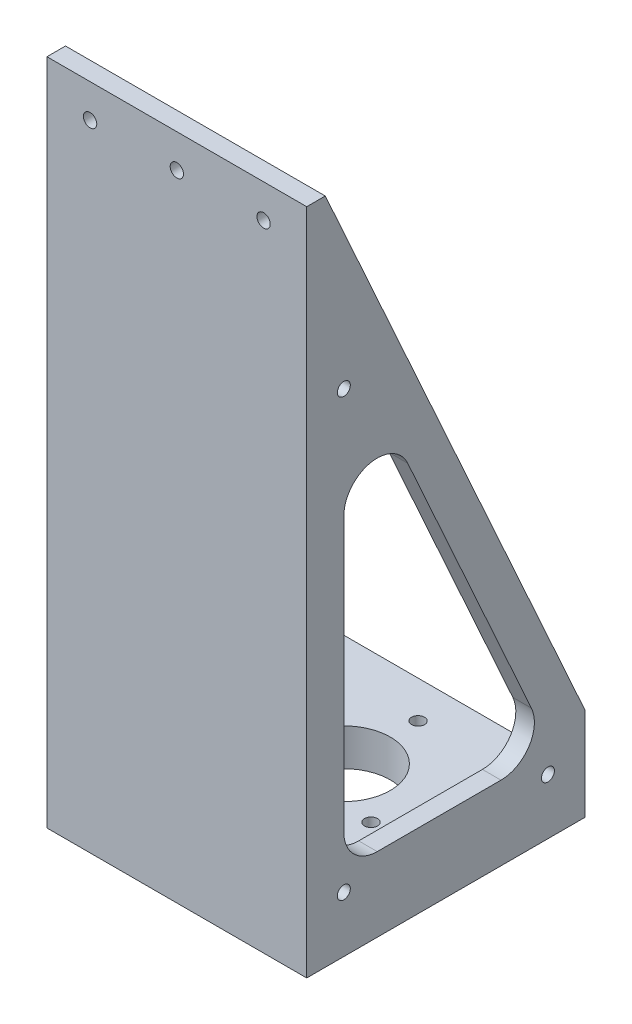
ISO-10303-21;
HEADER;
FILE_DESCRIPTION(('STEP AP214'),'2;1');
FILE_NAME('part.step','',(''),(''),'','','');
FILE_SCHEMA(('AUTOMOTIVE_DESIGN { 1 0 10303 214 1 1 1 1 }'));
ENDSEC;
DATA;
#1=APPLICATION_CONTEXT('core data for automotive mechanical design processes');
#2=APPLICATION_PROTOCOL_DEFINITION('international standard','automotive_design',2000,#1);
#3=PRODUCT_CONTEXT('',#1,'mechanical');
#4=PRODUCT('Part','Part','',(#3));
#5=PRODUCT_RELATED_PRODUCT_CATEGORY('part','',(#4));
#6=PRODUCT_DEFINITION_FORMATION('','',#4);
#7=PRODUCT_DEFINITION_CONTEXT('part definition',#1,'design');
#8=PRODUCT_DEFINITION('design','',#6,#7);
#9=PRODUCT_DEFINITION_SHAPE('','',#8);
#10=(LENGTH_UNIT() NAMED_UNIT(*) SI_UNIT(.MILLI.,.METRE.));
#11=(NAMED_UNIT(*) PLANE_ANGLE_UNIT() SI_UNIT($,.RADIAN.));
#12=(NAMED_UNIT(*) SI_UNIT($,.STERADIAN.) SOLID_ANGLE_UNIT());
#13=UNCERTAINTY_MEASURE_WITH_UNIT(LENGTH_MEASURE(1.E-05),#10,'distance_accuracy_value','');
#14=(GEOMETRIC_REPRESENTATION_CONTEXT(3) GLOBAL_UNCERTAINTY_ASSIGNED_CONTEXT((#13)) GLOBAL_UNIT_ASSIGNED_CONTEXT((#10,
#11,#12)) REPRESENTATION_CONTEXT('',''));
#15=CARTESIAN_POINT('',(0.,0.,0.));
#16=DIRECTION('',(0.,0.,1.));
#17=DIRECTION('',(1.,0.,0.));
#18=AXIS2_PLACEMENT_3D('',#15,#16,#17);
#19=CARTESIAN_POINT('',(0.,10.,0.));
#20=DIRECTION('',(0.,-1.,0.));
#21=DIRECTION('',(0.,0.,-1.));
#22=AXIS2_PLACEMENT_3D('',#19,#20,#21);
#23=PLANE('',#22);
#24=CARTESIAN_POINT('',(0.,10.,0.));
#25=DIRECTION('',(0.,1.,0.));
#26=DIRECTION('',(0.,0.,1.));
#27=AXIS2_PLACEMENT_3D('',#24,#25,#26);
#28=CIRCLE('',#27,12.5);
#29=CARTESIAN_POINT('',(0.,10.,12.5));
#30=VERTEX_POINT('',#29);
#31=EDGE_CURVE('E431',#30,#30,#28,.T.);
#32=ORIENTED_EDGE('',*,*,#31,.F.);
#33=EDGE_LOOP('',(#32));
#34=FACE_BOUND('',#33,.T.);
#35=CARTESIAN_POINT('',(0.,10.,-20.));
#36=DIRECTION('',(0.,1.,0.));
#37=DIRECTION('',(0.,0.,1.));
#38=AXIS2_PLACEMENT_3D('',#35,#36,#37);
#39=CIRCLE('',#38,1.75);
#40=CARTESIAN_POINT('',(0.,10.,-18.25));
#41=VERTEX_POINT('',#40);
#42=EDGE_CURVE('E421',#41,#41,#39,.T.);
#43=ORIENTED_EDGE('',*,*,#42,.F.);
#44=EDGE_LOOP('',(#43));
#45=FACE_BOUND('',#44,.T.);
#46=CARTESIAN_POINT('',(17.3205080756901,10.,9.99999999999926));
#47=DIRECTION('',(0.,1.,0.));
#48=DIRECTION('',(0.,0.,1.));
#49=AXIS2_PLACEMENT_3D('',#46,#47,#48);
#50=CIRCLE('',#49,1.75000000000109);
#51=CARTESIAN_POINT('',(17.3205080756901,10.,11.7500000000004));
#52=VERTEX_POINT('',#51);
#53=EDGE_CURVE('E413',#52,#52,#50,.T.);
#54=ORIENTED_EDGE('',*,*,#53,.F.);
#55=EDGE_LOOP('',(#54));
#56=FACE_BOUND('',#55,.T.);
#57=CARTESIAN_POINT('',(-17.3205080756875,10.,10.0000000000007));
#58=DIRECTION('',(0.,1.,0.));
#59=DIRECTION('',(0.,0.,1.));
#60=AXIS2_PLACEMENT_3D('',#57,#58,#59);
#61=CIRCLE('',#60,1.7500000000016);
#62=CARTESIAN_POINT('',(-17.3205080756875,10.,11.7500000000023));
#63=VERTEX_POINT('',#62);
#64=EDGE_CURVE('E410',#63,#63,#61,.T.);
#65=ORIENTED_EDGE('',*,*,#64,.F.);
#66=EDGE_LOOP('',(#65));
#67=FACE_BOUND('',#66,.T.);
#68=DIRECTION('',(0.,0.,-1.));
#69=VECTOR('',#68,1.);
#70=CARTESIAN_POINT('',(-30.,10.,0.));
#71=LINE('',#70,#69);
#72=CARTESIAN_POINT('',(-30.,10.,40.));
#73=VERTEX_POINT('',#72);
#74=CARTESIAN_POINT('',(-30.,10.,-30.));
#75=VERTEX_POINT('',#74);
#76=EDGE_CURVE('E468',#73,#75,#71,.T.);
#77=ORIENTED_EDGE('',*,*,#76,.F.);
#78=DIRECTION('',(1.,0.,0.));
#79=VECTOR('',#78,1.);
#80=CARTESIAN_POINT('',(0.,10.,40.));
#81=LINE('',#80,#79);
#82=CARTESIAN_POINT('',(30.,9.99999999999999,40.));
#83=VERTEX_POINT('',#82);
#84=EDGE_CURVE('E343',#73,#83,#81,.T.);
#85=ORIENTED_EDGE('',*,*,#84,.T.);
#86=DIRECTION('',(0.,0.,1.));
#87=VECTOR('',#86,1.);
#88=CARTESIAN_POINT('',(30.,10.,0.));
#89=LINE('',#88,#87);
#90=CARTESIAN_POINT('',(30.,10.,-30.));
#91=VERTEX_POINT('',#90);
#92=EDGE_CURVE('E375',#91,#83,#89,.T.);
#93=ORIENTED_EDGE('',*,*,#92,.F.);
#94=DIRECTION('',(-1.,0.,0.));
#95=VECTOR('',#94,1.);
#96=CARTESIAN_POINT('',(-35.,10.,-30.));
#97=LINE('',#96,#95);
#98=EDGE_CURVE('E437',#91,#75,#97,.T.);
#99=ORIENTED_EDGE('',*,*,#98,.T.);
#100=EDGE_LOOP('',(#77,#85,#93,#99));
#101=FACE_BOUND('',#100,.T.);
#102=ADVANCED_FACE('F44',(#34,#45,#56,#67,#101),#23,.F.);
#103=CARTESIAN_POINT('',(0.,0.,0.));
#104=DIRECTION('',(0.,-1.,0.));
#105=DIRECTION('',(0.,0.,-1.));
#106=AXIS2_PLACEMENT_3D('',#103,#104,#105);
#107=PLANE('',#106);
#108=DIRECTION('',(-1.,0.,0.));
#109=VECTOR('',#108,1.);
#110=CARTESIAN_POINT('',(-35.,0.,-30.));
#111=LINE('',#110,#109);
#112=CARTESIAN_POINT('',(35.,0.,-30.));
#113=VERTEX_POINT('',#112);
#114=CARTESIAN_POINT('',(-35.,0.,-30.));
#115=VERTEX_POINT('',#114);
#116=EDGE_CURVE('E443',#113,#115,#111,.T.);
#117=ORIENTED_EDGE('',*,*,#116,.F.);
#118=DIRECTION('',(0.,0.,-1.));
#119=VECTOR('',#118,1.);
#120=CARTESIAN_POINT('',(35.,0.,45.));
#121=LINE('',#120,#119);
#122=CARTESIAN_POINT('',(35.,0.,45.));
#123=VERTEX_POINT('',#122);
#124=EDGE_CURVE('E448',#123,#113,#121,.T.);
#125=ORIENTED_EDGE('',*,*,#124,.F.);
#126=DIRECTION('',(1.,0.,0.));
#127=VECTOR('',#126,1.);
#128=CARTESIAN_POINT('',(-35.,0.,45.));
#129=LINE('',#128,#127);
#130=CARTESIAN_POINT('',(-35.,0.,45.));
#131=VERTEX_POINT('',#130);
#132=EDGE_CURVE('E450',#131,#123,#129,.T.);
#133=ORIENTED_EDGE('',*,*,#132,.F.);
#134=DIRECTION('',(0.,0.,1.));
#135=VECTOR('',#134,1.);
#136=CARTESIAN_POINT('',(-35.,0.,45.));
#137=LINE('',#136,#135);
#138=EDGE_CURVE('E434',#115,#131,#137,.T.);
#139=ORIENTED_EDGE('',*,*,#138,.F.);
#140=EDGE_LOOP('',(#117,#125,#133,#139));
#141=FACE_BOUND('',#140,.T.);
#142=CARTESIAN_POINT('',(17.3205080756901,0.,9.99999999999926));
#143=DIRECTION('',(0.,1.,0.));
#144=DIRECTION('',(0.,0.,1.));
#145=AXIS2_PLACEMENT_3D('',#142,#143,#144);
#146=CIRCLE('',#145,1.75000000000109);
#147=CARTESIAN_POINT('',(17.3205080756901,0.,11.7500000000004));
#148=VERTEX_POINT('',#147);
#149=EDGE_CURVE('E412',#148,#148,#146,.T.);
#150=ORIENTED_EDGE('',*,*,#149,.T.);
#151=EDGE_LOOP('',(#150));
#152=FACE_BOUND('',#151,.T.);
#153=CARTESIAN_POINT('',(0.,0.,0.));
#154=DIRECTION('',(0.,1.,0.));
#155=DIRECTION('',(0.,0.,1.));
#156=AXIS2_PLACEMENT_3D('',#153,#154,#155);
#157=CIRCLE('',#156,12.5);
#158=CARTESIAN_POINT('',(0.,0.,12.5));
#159=VERTEX_POINT('',#158);
#160=EDGE_CURVE('E430',#159,#159,#157,.T.);
#161=ORIENTED_EDGE('',*,*,#160,.T.);
#162=EDGE_LOOP('',(#161));
#163=FACE_BOUND('',#162,.T.);
#164=CARTESIAN_POINT('',(0.,0.,-20.));
#165=DIRECTION('',(0.,1.,0.));
#166=DIRECTION('',(0.,0.,1.));
#167=AXIS2_PLACEMENT_3D('',#164,#165,#166);
#168=CIRCLE('',#167,1.75);
#169=CARTESIAN_POINT('',(0.,0.,-18.25));
#170=VERTEX_POINT('',#169);
#171=EDGE_CURVE('E419',#170,#170,#168,.T.);
#172=ORIENTED_EDGE('',*,*,#171,.T.);
#173=EDGE_LOOP('',(#172));
#174=FACE_BOUND('',#173,.T.);
#175=CARTESIAN_POINT('',(-17.3205080756875,0.,10.0000000000007));
#176=DIRECTION('',(0.,1.,0.));
#177=DIRECTION('',(0.,0.,1.));
#178=AXIS2_PLACEMENT_3D('',#175,#176,#177);
#179=CIRCLE('',#178,1.7500000000016);
#180=CARTESIAN_POINT('',(-17.3205080756875,0.,11.7500000000023));
#181=VERTEX_POINT('',#180);
#182=EDGE_CURVE('E396',#181,#181,#179,.T.);
#183=ORIENTED_EDGE('',*,*,#182,.T.);
#184=EDGE_LOOP('',(#183));
#185=FACE_BOUND('',#184,.T.);
#186=ADVANCED_FACE('F527',(#141,#152,#163,#174,#185),#107,.T.);
#187=CARTESIAN_POINT('',(-35.,10.,45.));
#188=DIRECTION('',(1.,0.,0.));
#189=DIRECTION('',(0.,0.,-1.));
#190=AXIS2_PLACEMENT_3D('',#187,#188,#189);
#191=PLANE('',#190);
#192=CARTESIAN_POINT('',(-35.,15.,-20.));
#193=DIRECTION('',(-1.,0.,0.));
#194=DIRECTION('',(0.,0.,1.));
#195=AXIS2_PLACEMENT_3D('',#192,#193,#194);
#196=CIRCLE('',#195,1.75);
#197=CARTESIAN_POINT('',(-35.,15.,-18.25));
#198=VERTEX_POINT('',#197);
#199=EDGE_CURVE('E897',#198,#198,#196,.T.);
#200=ORIENTED_EDGE('',*,*,#199,.F.);
#201=EDGE_LOOP('',(#200));
#202=FACE_BOUND('',#201,.T.);
#203=CARTESIAN_POINT('',(-35.,15.,35.));
#204=DIRECTION('',(-1.,0.,0.));
#205=DIRECTION('',(0.,0.,1.));
#206=AXIS2_PLACEMENT_3D('',#203,#204,#205);
#207=CIRCLE('',#206,1.75);
#208=CARTESIAN_POINT('',(-35.,15.,36.75));
#209=VERTEX_POINT('',#208);
#210=EDGE_CURVE('E926',#209,#209,#207,.T.);
#211=ORIENTED_EDGE('',*,*,#210,.F.);
#212=EDGE_LOOP('',(#211));
#213=FACE_BOUND('',#212,.T.);
#214=CARTESIAN_POINT('',(-35.,132.484247103511,35.));
#215=DIRECTION('',(-1.,0.,0.));
#216=DIRECTION('',(0.,0.,1.));
#217=AXIS2_PLACEMENT_3D('',#214,#215,#216);
#218=CIRCLE('',#217,1.75);
#219=CARTESIAN_POINT('',(-35.,132.484247103511,36.75));
#220=VERTEX_POINT('',#219);
#221=EDGE_CURVE('E243',#220,#220,#218,.T.);
#222=ORIENTED_EDGE('',*,*,#221,.F.);
#223=EDGE_LOOP('',(#222));
#224=FACE_BOUND('',#223,.T.);
#225=DIRECTION('',(0.,1.,0.));
#226=VECTOR('',#225,1.);
#227=CARTESIAN_POINT('',(-35.,102.837189188257,35.));
#228=LINE('',#227,#226);
#229=CARTESIAN_POINT('',(-35.,29.,35.));
#230=VERTEX_POINT('',#229);
#231=CARTESIAN_POINT('',(-35.,102.837189188257,35.));
#232=VERTEX_POINT('',#231);
#233=EDGE_CURVE('E245',#230,#232,#228,.T.);
#234=ORIENTED_EDGE('',*,*,#233,.F.);
#235=CARTESIAN_POINT('',(-35.,29.,26.));
#236=DIRECTION('',(-1.,0.,0.));
#237=DIRECTION('',(0.,0.,1.));
#238=AXIS2_PLACEMENT_3D('',#235,#236,#237);
#239=CIRCLE('',#238,8.99999999999999);
#240=CARTESIAN_POINT('',(-35.,20.,26.));
#241=VERTEX_POINT('',#240);
#242=EDGE_CURVE('E64',#241,#230,#239,.T.);
#243=ORIENTED_EDGE('',*,*,#242,.F.);
#244=DIRECTION('',(0.,0.,1.));
#245=VECTOR('',#244,1.);
#246=CARTESIAN_POINT('',(-35.,20.,26.));
#247=LINE('',#246,#245);
#248=CARTESIAN_POINT('',(-35.,20.,-7.34582737534168));
#249=VERTEX_POINT('',#248);
#250=EDGE_CURVE('E216',#249,#241,#247,.T.);
#251=ORIENTED_EDGE('',*,*,#250,.F.);
#252=CARTESIAN_POINT('',(-35.,29.,-7.34582737534168));
#253=DIRECTION('',(-1.,0.,0.));
#254=DIRECTION('',(0.,0.,1.));
#255=AXIS2_PLACEMENT_3D('',#252,#253,#254);
#256=CIRCLE('',#255,9.);
#257=CARTESIAN_POINT('',(-35.,32.7042805018385,-15.5481627722697));
#258=VERTEX_POINT('',#257);
#259=EDGE_CURVE('E223',#258,#249,#256,.T.);
#260=ORIENTED_EDGE('',*,*,#259,.F.);
#261=DIRECTION('',(0.,-0.911370599658675,-0.411586722426498));
#262=VECTOR('',#261,1.);
#263=CARTESIAN_POINT('',(-35.,32.7042805018385,-15.5481627722697));
#264=LINE('',#263,#262);
#265=CARTESIAN_POINT('',(-35.,106.541469690095,17.7976646030719));
#266=VERTEX_POINT('',#265);
#267=EDGE_CURVE('E252',#266,#258,#264,.T.);
#268=ORIENTED_EDGE('',*,*,#267,.F.);
#269=CARTESIAN_POINT('',(-35.,102.837189188257,26.));
#270=DIRECTION('',(-1.,0.,0.));
#271=DIRECTION('',(0.,0.,1.));
#272=AXIS2_PLACEMENT_3D('',#269,#270,#271);
#273=CIRCLE('',#272,8.99999999999999);
#274=EDGE_CURVE('E250',#232,#266,#273,.T.);
#275=ORIENTED_EDGE('',*,*,#274,.F.);
#276=EDGE_LOOP('',(#234,#243,#251,#260,#268,#275));
#277=FACE_BOUND('',#276,.T.);
#278=DIRECTION('',(0.,0.,-1.));
#279=VECTOR('',#278,1.);
#280=CARTESIAN_POINT('',(-35.,180.,45.));
#281=LINE('',#280,#279);
#282=CARTESIAN_POINT('',(-35.,180.,45.));
#283=VERTEX_POINT('',#282);
#284=CARTESIAN_POINT('',(-35.,180.,40.));
#285=VERTEX_POINT('',#284);
#286=EDGE_CURVE('E378',#283,#285,#281,.T.);
#287=ORIENTED_EDGE('',*,*,#286,.T.);
#288=DIRECTION('',(0.,-0.911370599658675,-0.411586722426498));
#289=VECTOR('',#288,1.);
#290=CARTESIAN_POINT('',(-35.,180.,40.));
#291=LINE('',#290,#289);
#292=CARTESIAN_POINT('',(-35.,25.,-30.));
#293=VERTEX_POINT('',#292);
#294=EDGE_CURVE('E383',#285,#293,#291,.T.);
#295=ORIENTED_EDGE('',*,*,#294,.T.);
#296=DIRECTION('',(0.,-1.,0.));
#297=VECTOR('',#296,1.);
#298=CARTESIAN_POINT('',(-35.,10.,-30.));
#299=LINE('',#298,#297);
#300=EDGE_CURVE('E442',#293,#115,#299,.T.);
#301=ORIENTED_EDGE('',*,*,#300,.T.);
#302=ORIENTED_EDGE('',*,*,#138,.T.);
#303=DIRECTION('',(0.,-1.,0.));
#304=VECTOR('',#303,1.);
#305=CARTESIAN_POINT('',(-35.,10.,45.));
#306=LINE('',#305,#304);
#307=EDGE_CURVE('E467',#283,#131,#306,.T.);
#308=ORIENTED_EDGE('',*,*,#307,.F.);
#309=EDGE_LOOP('',(#287,#295,#301,#302,#308));
#310=FACE_BOUND('',#309,.T.);
#311=ADVANCED_FACE('F50',(#202,#213,#224,#277,#310),#191,.F.);
#312=CARTESIAN_POINT('',(-35.,10.,45.));
#313=DIRECTION('',(0.,0.,-1.));
#314=DIRECTION('',(-1.,0.,0.));
#315=AXIS2_PLACEMENT_3D('',#312,#313,#314);
#316=PLANE('',#315);
#317=CARTESIAN_POINT('',(23.375,171.,45.));
#318=DIRECTION('',(0.,0.,-1.));
#319=DIRECTION('',(-1.,0.,0.));
#320=AXIS2_PLACEMENT_3D('',#317,#318,#319);
#321=CIRCLE('',#320,1.8);
#322=CARTESIAN_POINT('',(21.575,171.,45.));
#323=VERTEX_POINT('',#322);
#324=EDGE_CURVE('E319',#323,#323,#321,.T.);
#325=ORIENTED_EDGE('',*,*,#324,.T.);
#326=EDGE_LOOP('',(#325));
#327=FACE_BOUND('',#326,.T.);
#328=CARTESIAN_POINT('',(-23.375,171.,45.));
#329=DIRECTION('',(0.,0.,-1.));
#330=DIRECTION('',(-1.,0.,0.));
#331=AXIS2_PLACEMENT_3D('',#328,#329,#330);
#332=CIRCLE('',#331,1.8);
#333=CARTESIAN_POINT('',(-25.175,171.,45.));
#334=VERTEX_POINT('',#333);
#335=EDGE_CURVE('E332',#334,#334,#332,.T.);
#336=ORIENTED_EDGE('',*,*,#335,.T.);
#337=EDGE_LOOP('',(#336));
#338=FACE_BOUND('',#337,.T.);
#339=CARTESIAN_POINT('',(0.,171.,45.));
#340=DIRECTION('',(0.,0.,-1.));
#341=DIRECTION('',(-1.,0.,0.));
#342=AXIS2_PLACEMENT_3D('',#339,#340,#341);
#343=CIRCLE('',#342,1.8);
#344=CARTESIAN_POINT('',(-1.8,171.,45.));
#345=VERTEX_POINT('',#344);
#346=EDGE_CURVE('E320',#345,#345,#343,.T.);
#347=ORIENTED_EDGE('',*,*,#346,.T.);
#348=EDGE_LOOP('',(#347));
#349=FACE_BOUND('',#348,.T.);
#350=DIRECTION('',(0.,-1.,0.));
#351=VECTOR('',#350,1.);
#352=CARTESIAN_POINT('',(35.,10.,45.));
#353=LINE('',#352,#351);
#354=CARTESIAN_POINT('',(35.,180.,45.));
#355=VERTEX_POINT('',#354);
#356=EDGE_CURVE('E465',#355,#123,#353,.T.);
#357=ORIENTED_EDGE('',*,*,#356,.F.);
#358=DIRECTION('',(-1.,0.,0.));
#359=VECTOR('',#358,1.);
#360=CARTESIAN_POINT('',(-30.,180.,45.));
#361=LINE('',#360,#359);
#362=EDGE_CURVE('E386',#355,#283,#361,.T.);
#363=ORIENTED_EDGE('',*,*,#362,.T.);
#364=ORIENTED_EDGE('',*,*,#307,.T.);
#365=ORIENTED_EDGE('',*,*,#132,.T.);
#366=EDGE_LOOP('',(#357,#363,#364,#365));
#367=FACE_BOUND('',#366,.T.);
#368=ADVANCED_FACE('F543',(#327,#338,#349,#367),#316,.F.);
#369=CARTESIAN_POINT('',(35.,10.,45.));
#370=DIRECTION('',(-1.,0.,0.));
#371=DIRECTION('',(0.,0.,1.));
#372=AXIS2_PLACEMENT_3D('',#369,#370,#371);
#373=PLANE('',#372);
#374=CARTESIAN_POINT('',(35.,15.,-20.));
#375=DIRECTION('',(-1.,0.,0.));
#376=DIRECTION('',(0.,0.,1.));
#377=AXIS2_PLACEMENT_3D('',#374,#375,#376);
#378=CIRCLE('',#377,1.75);
#379=CARTESIAN_POINT('',(35.,15.,-18.25));
#380=VERTEX_POINT('',#379);
#381=EDGE_CURVE('E228',#380,#380,#378,.T.);
#382=ORIENTED_EDGE('',*,*,#381,.T.);
#383=EDGE_LOOP('',(#382));
#384=FACE_BOUND('',#383,.T.);
#385=CARTESIAN_POINT('',(35.,15.,35.));
#386=DIRECTION('',(-1.,0.,0.));
#387=DIRECTION('',(0.,0.,1.));
#388=AXIS2_PLACEMENT_3D('',#385,#386,#387);
#389=CIRCLE('',#388,1.75);
#390=CARTESIAN_POINT('',(35.,15.,36.75));
#391=VERTEX_POINT('',#390);
#392=EDGE_CURVE('E923',#391,#391,#389,.T.);
#393=ORIENTED_EDGE('',*,*,#392,.T.);
#394=EDGE_LOOP('',(#393));
#395=FACE_BOUND('',#394,.T.);
#396=CARTESIAN_POINT('',(35.,132.484247103511,35.));
#397=DIRECTION('',(-1.,0.,0.));
#398=DIRECTION('',(0.,0.,1.));
#399=AXIS2_PLACEMENT_3D('',#396,#397,#398);
#400=CIRCLE('',#399,1.75);
#401=CARTESIAN_POINT('',(35.,132.484247103511,36.75));
#402=VERTEX_POINT('',#401);
#403=EDGE_CURVE('E937',#402,#402,#400,.T.);
#404=ORIENTED_EDGE('',*,*,#403,.T.);
#405=EDGE_LOOP('',(#404));
#406=FACE_BOUND('',#405,.T.);
#407=DIRECTION('',(0.,0.,1.));
#408=VECTOR('',#407,1.);
#409=CARTESIAN_POINT('',(35.,20.,26.));
#410=LINE('',#409,#408);
#411=CARTESIAN_POINT('',(35.,20.,-7.34582737534168));
#412=VERTEX_POINT('',#411);
#413=CARTESIAN_POINT('',(35.,20.,26.));
#414=VERTEX_POINT('',#413);
#415=EDGE_CURVE('E220',#412,#414,#410,.T.);
#416=ORIENTED_EDGE('',*,*,#415,.T.);
#417=CARTESIAN_POINT('',(35.,29.,26.));
#418=DIRECTION('',(-1.,0.,0.));
#419=DIRECTION('',(0.,0.,1.));
#420=AXIS2_PLACEMENT_3D('',#417,#418,#419);
#421=CIRCLE('',#420,8.99999999999999);
#422=CARTESIAN_POINT('',(35.,29.,35.));
#423=VERTEX_POINT('',#422);
#424=EDGE_CURVE('E199',#414,#423,#421,.T.);
#425=ORIENTED_EDGE('',*,*,#424,.T.);
#426=DIRECTION('',(0.,1.,0.));
#427=VECTOR('',#426,1.);
#428=CARTESIAN_POINT('',(35.,102.837189188257,35.));
#429=LINE('',#428,#427);
#430=CARTESIAN_POINT('',(35.,102.837189188257,35.));
#431=VERTEX_POINT('',#430);
#432=EDGE_CURVE('E210',#423,#431,#429,.T.);
#433=ORIENTED_EDGE('',*,*,#432,.T.);
#434=CARTESIAN_POINT('',(35.,102.837189188257,26.));
#435=DIRECTION('',(-1.,0.,0.));
#436=DIRECTION('',(0.,0.,1.));
#437=AXIS2_PLACEMENT_3D('',#434,#435,#436);
#438=CIRCLE('',#437,8.99999999999999);
#439=CARTESIAN_POINT('',(35.,106.541469690095,17.7976646030719));
#440=VERTEX_POINT('',#439);
#441=EDGE_CURVE('E72',#431,#440,#438,.T.);
#442=ORIENTED_EDGE('',*,*,#441,.T.);
#443=DIRECTION('',(0.,-0.911370599658675,-0.411586722426498));
#444=VECTOR('',#443,1.);
#445=CARTESIAN_POINT('',(35.,32.7042805018385,-15.5481627722697));
#446=LINE('',#445,#444);
#447=CARTESIAN_POINT('',(35.,32.7042805018385,-15.5481627722697));
#448=VERTEX_POINT('',#447);
#449=EDGE_CURVE('E233',#440,#448,#446,.T.);
#450=ORIENTED_EDGE('',*,*,#449,.T.);
#451=CARTESIAN_POINT('',(35.,29.,-7.34582737534168));
#452=DIRECTION('',(-1.,0.,0.));
#453=DIRECTION('',(0.,0.,1.));
#454=AXIS2_PLACEMENT_3D('',#451,#452,#453);
#455=CIRCLE('',#454,9.);
#456=EDGE_CURVE('E232',#448,#412,#455,.T.);
#457=ORIENTED_EDGE('',*,*,#456,.T.);
#458=EDGE_LOOP('',(#416,#425,#433,#442,#450,#457));
#459=FACE_BOUND('',#458,.T.);
#460=ORIENTED_EDGE('',*,*,#124,.T.);
#461=DIRECTION('',(0.,-1.,0.));
#462=VECTOR('',#461,1.);
#463=CARTESIAN_POINT('',(35.,10.,-30.));
#464=LINE('',#463,#462);
#465=CARTESIAN_POINT('',(35.,25.,-30.));
#466=VERTEX_POINT('',#465);
#467=EDGE_CURVE('E459',#466,#113,#464,.T.);
#468=ORIENTED_EDGE('',*,*,#467,.F.);
#469=DIRECTION('',(0.,0.911370599658675,0.411586722426499));
#470=VECTOR('',#469,1.);
#471=CARTESIAN_POINT('',(35.,180.,40.));
#472=LINE('',#471,#470);
#473=CARTESIAN_POINT('',(35.,180.,40.));
#474=VERTEX_POINT('',#473);
#475=EDGE_CURVE('E353',#466,#474,#472,.T.);
#476=ORIENTED_EDGE('',*,*,#475,.T.);
#477=DIRECTION('',(0.,0.,1.));
#478=VECTOR('',#477,1.);
#479=CARTESIAN_POINT('',(35.,180.,45.));
#480=LINE('',#479,#478);
#481=EDGE_CURVE('E356',#474,#355,#480,.T.);
#482=ORIENTED_EDGE('',*,*,#481,.T.);
#483=ORIENTED_EDGE('',*,*,#356,.T.);
#484=EDGE_LOOP('',(#460,#468,#476,#482,#483));
#485=FACE_BOUND('',#484,.T.);
#486=ADVANCED_FACE('F214',(#384,#395,#406,#459,#485),#373,.F.);
#487=CARTESIAN_POINT('',(-35.,10.,-30.));
#488=DIRECTION('',(0.,0.,1.));
#489=DIRECTION('',(1.,0.,0.));
#490=AXIS2_PLACEMENT_3D('',#487,#488,#489);
#491=PLANE('',#490);
#492=ORIENTED_EDGE('',*,*,#116,.T.);
#493=ORIENTED_EDGE('',*,*,#300,.F.);
#494=DIRECTION('',(-1.,0.,0.));
#495=VECTOR('',#494,1.);
#496=CARTESIAN_POINT('',(-30.,25.,-30.));
#497=LINE('',#496,#495);
#498=CARTESIAN_POINT('',(-30.,25.,-30.));
#499=VERTEX_POINT('',#498);
#500=EDGE_CURVE('E397',#499,#293,#497,.T.);
#501=ORIENTED_EDGE('',*,*,#500,.F.);
#502=DIRECTION('',(0.,-1.,0.));
#503=VECTOR('',#502,1.);
#504=CARTESIAN_POINT('',(-30.,0.,-30.));
#505=LINE('',#504,#503);
#506=EDGE_CURVE('E381',#499,#75,#505,.T.);
#507=ORIENTED_EDGE('',*,*,#506,.T.);
#508=ORIENTED_EDGE('',*,*,#98,.F.);
#509=DIRECTION('',(0.,1.,0.));
#510=VECTOR('',#509,1.);
#511=CARTESIAN_POINT('',(30.,0.,-30.));
#512=LINE('',#511,#510);
#513=CARTESIAN_POINT('',(30.,25.,-30.));
#514=VERTEX_POINT('',#513);
#515=EDGE_CURVE('E354',#91,#514,#512,.T.);
#516=ORIENTED_EDGE('',*,*,#515,.T.);
#517=DIRECTION('',(1.,0.,0.));
#518=VECTOR('',#517,1.);
#519=CARTESIAN_POINT('',(30.,25.,-30.));
#520=LINE('',#519,#518);
#521=EDGE_CURVE('E365',#514,#466,#520,.T.);
#522=ORIENTED_EDGE('',*,*,#521,.T.);
#523=ORIENTED_EDGE('',*,*,#467,.T.);
#524=EDGE_LOOP('',(#492,#493,#501,#507,#508,#516,#522,#523));
#525=FACE_BOUND('',#524,.T.);
#526=ADVANCED_FACE('F542',(#525),#491,.F.);
#527=CARTESIAN_POINT('',(0.,10.,0.));
#528=DIRECTION('',(0.,-1.,0.));
#529=DIRECTION('',(0.,0.,-1.));
#530=AXIS2_PLACEMENT_3D('',#527,#528,#529);
#531=CYLINDRICAL_SURFACE('',#530,12.5);
#532=ORIENTED_EDGE('',*,*,#31,.T.);
#533=EDGE_LOOP('',(#532));
#534=FACE_BOUND('',#533,.T.);
#535=ORIENTED_EDGE('',*,*,#160,.F.);
#536=EDGE_LOOP('',(#535));
#537=FACE_BOUND('',#536,.T.);
#538=ADVANCED_FACE('F539',(#534,#537),#531,.F.);
#539=CARTESIAN_POINT('',(0.,10.,-20.));
#540=DIRECTION('',(0.,-1.,0.));
#541=DIRECTION('',(0.,0.,-1.));
#542=AXIS2_PLACEMENT_3D('',#539,#540,#541);
#543=CYLINDRICAL_SURFACE('',#542,1.75);
#544=ORIENTED_EDGE('',*,*,#42,.T.);
#545=EDGE_LOOP('',(#544));
#546=FACE_BOUND('',#545,.T.);
#547=ORIENTED_EDGE('',*,*,#171,.F.);
#548=EDGE_LOOP('',(#547));
#549=FACE_BOUND('',#548,.T.);
#550=ADVANCED_FACE('F608',(#546,#549),#543,.F.);
#551=CARTESIAN_POINT('',(17.3205080756901,10.,9.99999999999926));
#552=DIRECTION('',(0.,-1.,0.));
#553=DIRECTION('',(0.,0.,-1.));
#554=AXIS2_PLACEMENT_3D('',#551,#552,#553);
#555=CYLINDRICAL_SURFACE('',#554,1.75000000000109);
#556=ORIENTED_EDGE('',*,*,#53,.T.);
#557=EDGE_LOOP('',(#556));
#558=FACE_BOUND('',#557,.T.);
#559=ORIENTED_EDGE('',*,*,#149,.F.);
#560=EDGE_LOOP('',(#559));
#561=FACE_BOUND('',#560,.T.);
#562=ADVANCED_FACE('F610',(#558,#561),#555,.F.);
#563=CARTESIAN_POINT('',(-17.3205080756875,10.,10.0000000000007));
#564=DIRECTION('',(0.,-1.,0.));
#565=DIRECTION('',(0.,0.,-1.));
#566=AXIS2_PLACEMENT_3D('',#563,#564,#565);
#567=CYLINDRICAL_SURFACE('',#566,1.7500000000016);
#568=ORIENTED_EDGE('',*,*,#64,.T.);
#569=EDGE_LOOP('',(#568));
#570=FACE_BOUND('',#569,.T.);
#571=ORIENTED_EDGE('',*,*,#182,.F.);
#572=EDGE_LOOP('',(#571));
#573=FACE_BOUND('',#572,.T.);
#574=ADVANCED_FACE('F598',(#570,#573),#567,.F.);
#575=CARTESIAN_POINT('',(-30.,0.,0.));
#576=DIRECTION('',(-1.,0.,0.));
#577=DIRECTION('',(0.,0.,1.));
#578=AXIS2_PLACEMENT_3D('',#575,#576,#577);
#579=PLANE('',#578);
#580=CARTESIAN_POINT('',(-30.,15.,-20.));
#581=DIRECTION('',(-1.,0.,0.));
#582=DIRECTION('',(0.,0.,1.));
#583=AXIS2_PLACEMENT_3D('',#580,#581,#582);
#584=CIRCLE('',#583,1.75);
#585=CARTESIAN_POINT('',(-30.,15.,-18.25));
#586=VERTEX_POINT('',#585);
#587=EDGE_CURVE('E312',#586,#586,#584,.T.);
#588=ORIENTED_EDGE('',*,*,#587,.T.);
#589=EDGE_LOOP('',(#588));
#590=FACE_BOUND('',#589,.T.);
#591=CARTESIAN_POINT('',(-30.,15.,35.));
#592=DIRECTION('',(-1.,0.,0.));
#593=DIRECTION('',(0.,0.,1.));
#594=AXIS2_PLACEMENT_3D('',#591,#592,#593);
#595=CIRCLE('',#594,1.75);
#596=CARTESIAN_POINT('',(-30.,15.,36.75));
#597=VERTEX_POINT('',#596);
#598=EDGE_CURVE('E307',#597,#597,#595,.T.);
#599=ORIENTED_EDGE('',*,*,#598,.T.);
#600=EDGE_LOOP('',(#599));
#601=FACE_BOUND('',#600,.T.);
#602=CARTESIAN_POINT('',(-30.,132.484247103511,35.));
#603=DIRECTION('',(-1.,0.,0.));
#604=DIRECTION('',(0.,0.,1.));
#605=AXIS2_PLACEMENT_3D('',#602,#603,#604);
#606=CIRCLE('',#605,1.75);
#607=CARTESIAN_POINT('',(-30.,132.484247103511,36.75));
#608=VERTEX_POINT('',#607);
#609=EDGE_CURVE('E302',#608,#608,#606,.T.);
#610=ORIENTED_EDGE('',*,*,#609,.T.);
#611=EDGE_LOOP('',(#610));
#612=FACE_BOUND('',#611,.T.);
#613=DIRECTION('',(0.,0.,1.));
#614=VECTOR('',#613,1.);
#615=CARTESIAN_POINT('',(-30.,20.,0.));
#616=LINE('',#615,#614);
#617=CARTESIAN_POINT('',(-30.,20.,-7.34582737534168));
#618=VERTEX_POINT('',#617);
#619=CARTESIAN_POINT('',(-30.,20.,26.));
#620=VERTEX_POINT('',#619);
#621=EDGE_CURVE('E294',#618,#620,#616,.T.);
#622=ORIENTED_EDGE('',*,*,#621,.T.);
#623=CARTESIAN_POINT('',(-30.,29.,26.));
#624=DIRECTION('',(-1.,0.,0.));
#625=DIRECTION('',(0.,0.,1.));
#626=AXIS2_PLACEMENT_3D('',#623,#624,#625);
#627=CIRCLE('',#626,8.99999999999999);
#628=CARTESIAN_POINT('',(-30.,29.,35.));
#629=VERTEX_POINT('',#628);
#630=EDGE_CURVE('E299',#620,#629,#627,.T.);
#631=ORIENTED_EDGE('',*,*,#630,.T.);
#632=DIRECTION('',(0.,1.,0.));
#633=VECTOR('',#632,1.);
#634=CARTESIAN_POINT('',(-30.,0.,35.));
#635=LINE('',#634,#633);
#636=CARTESIAN_POINT('',(-30.,102.837189188257,35.));
#637=VERTEX_POINT('',#636);
#638=EDGE_CURVE('E262',#629,#637,#635,.T.);
#639=ORIENTED_EDGE('',*,*,#638,.T.);
#640=CARTESIAN_POINT('',(-30.,102.837189188257,26.));
#641=DIRECTION('',(-1.,0.,0.));
#642=DIRECTION('',(0.,0.,1.));
#643=AXIS2_PLACEMENT_3D('',#640,#641,#642);
#644=CIRCLE('',#643,8.99999999999999);
#645=CARTESIAN_POINT('',(-30.,106.541469690095,17.7976646030719));
#646=VERTEX_POINT('',#645);
#647=EDGE_CURVE('E284',#637,#646,#644,.T.);
#648=ORIENTED_EDGE('',*,*,#647,.T.);
#649=DIRECTION('',(0.,-0.911370599658675,-0.411586722426498));
#650=VECTOR('',#649,1.);
#651=CARTESIAN_POINT('',(-30.,11.3724646685613,-25.1818860518143));
#652=LINE('',#651,#650);
#653=CARTESIAN_POINT('',(-30.,32.7042805018385,-15.5481627722697));
#654=VERTEX_POINT('',#653);
#655=EDGE_CURVE('E290',#646,#654,#652,.T.);
#656=ORIENTED_EDGE('',*,*,#655,.T.);
#657=CARTESIAN_POINT('',(-30.,29.,-7.34582737534168));
#658=DIRECTION('',(-1.,0.,0.));
#659=DIRECTION('',(0.,0.,1.));
#660=AXIS2_PLACEMENT_3D('',#657,#658,#659);
#661=CIRCLE('',#660,9.);
#662=EDGE_CURVE('E293',#654,#618,#661,.T.);
#663=ORIENTED_EDGE('',*,*,#662,.T.);
#664=EDGE_LOOP('',(#622,#631,#639,#648,#656,#663));
#665=FACE_BOUND('',#664,.T.);
#666=DIRECTION('',(0.,-0.911370599658675,-0.411586722426498));
#667=VECTOR('',#666,1.);
#668=CARTESIAN_POINT('',(-30.,180.,40.));
#669=LINE('',#668,#667);
#670=CARTESIAN_POINT('',(-30.,180.,40.));
#671=VERTEX_POINT('',#670);
#672=EDGE_CURVE('E379',#671,#499,#669,.T.);
#673=ORIENTED_EDGE('',*,*,#672,.F.);
#674=DIRECTION('',(0.,-1.,0.));
#675=VECTOR('',#674,1.);
#676=CARTESIAN_POINT('',(-30.,0.,40.));
#677=LINE('',#676,#675);
#678=EDGE_CURVE('E346',#671,#73,#677,.T.);
#679=ORIENTED_EDGE('',*,*,#678,.T.);
#680=ORIENTED_EDGE('',*,*,#76,.T.);
#681=ORIENTED_EDGE('',*,*,#506,.F.);
#682=EDGE_LOOP('',(#673,#679,#680,#681));
#683=FACE_BOUND('',#682,.T.);
#684=ADVANCED_FACE('F588',(#590,#601,#612,#665,#683),#579,.F.);
#685=CARTESIAN_POINT('',(-30.,180.,40.));
#686=DIRECTION('',(0.,0.411586722426498,-0.911370599658675));
#687=DIRECTION('',(0.,0.911370599658675,0.411586722426498));
#688=AXIS2_PLACEMENT_3D('',#685,#686,#687);
#689=PLANE('',#688);
#690=ORIENTED_EDGE('',*,*,#294,.F.);
#691=DIRECTION('',(-1.,0.,0.));
#692=VECTOR('',#691,1.);
#693=CARTESIAN_POINT('',(-30.,180.,40.));
#694=LINE('',#693,#692);
#695=EDGE_CURVE('E402',#671,#285,#694,.T.);
#696=ORIENTED_EDGE('',*,*,#695,.F.);
#697=ORIENTED_EDGE('',*,*,#672,.T.);
#698=ORIENTED_EDGE('',*,*,#500,.T.);
#699=EDGE_LOOP('',(#690,#696,#697,#698));
#700=FACE_BOUND('',#699,.T.);
#701=ADVANCED_FACE('F595',(#700),#689,.T.);
#702=CARTESIAN_POINT('',(-30.,180.,45.));
#703=DIRECTION('',(0.,1.,0.));
#704=DIRECTION('',(0.,0.,1.));
#705=AXIS2_PLACEMENT_3D('',#702,#703,#704);
#706=PLANE('',#705);
#707=ORIENTED_EDGE('',*,*,#286,.F.);
#708=ORIENTED_EDGE('',*,*,#362,.F.);
#709=ORIENTED_EDGE('',*,*,#481,.F.);
#710=DIRECTION('',(1.,0.,0.));
#711=VECTOR('',#710,1.);
#712=CARTESIAN_POINT('',(30.,180.,40.));
#713=LINE('',#712,#711);
#714=CARTESIAN_POINT('',(30.,180.,40.));
#715=VERTEX_POINT('',#714);
#716=EDGE_CURVE('E367',#715,#474,#713,.T.);
#717=ORIENTED_EDGE('',*,*,#716,.F.);
#718=DIRECTION('',(-1.,0.,0.));
#719=VECTOR('',#718,1.);
#720=CARTESIAN_POINT('',(-35.,180.,40.));
#721=LINE('',#720,#719);
#722=EDGE_CURVE('E325',#715,#671,#721,.T.);
#723=ORIENTED_EDGE('',*,*,#722,.T.);
#724=ORIENTED_EDGE('',*,*,#695,.T.);
#725=EDGE_LOOP('',(#707,#708,#709,#717,#723,#724));
#726=FACE_BOUND('',#725,.T.);
#727=ADVANCED_FACE('F567',(#726),#706,.T.);
#728=CARTESIAN_POINT('',(30.,0.,0.));
#729=DIRECTION('',(1.,0.,0.));
#730=DIRECTION('',(0.,0.,-1.));
#731=AXIS2_PLACEMENT_3D('',#728,#729,#730);
#732=PLANE('',#731);
#733=CARTESIAN_POINT('',(30.,15.,-20.));
#734=DIRECTION('',(1.,0.,0.));
#735=DIRECTION('',(0.,0.,-1.));
#736=AXIS2_PLACEMENT_3D('',#733,#734,#735);
#737=CIRCLE('',#736,1.75);
#738=CARTESIAN_POINT('',(30.,15.,-21.75));
#739=VERTEX_POINT('',#738);
#740=EDGE_CURVE('E47',#739,#739,#737,.T.);
#741=ORIENTED_EDGE('',*,*,#740,.T.);
#742=EDGE_LOOP('',(#741));
#743=FACE_BOUND('',#742,.T.);
#744=CARTESIAN_POINT('',(30.,15.,35.));
#745=DIRECTION('',(1.,0.,0.));
#746=DIRECTION('',(0.,0.,-1.));
#747=AXIS2_PLACEMENT_3D('',#744,#745,#746);
#748=CIRCLE('',#747,1.75);
#749=CARTESIAN_POINT('',(30.,15.,33.25));
#750=VERTEX_POINT('',#749);
#751=EDGE_CURVE('E308',#750,#750,#748,.T.);
#752=ORIENTED_EDGE('',*,*,#751,.T.);
#753=EDGE_LOOP('',(#752));
#754=FACE_BOUND('',#753,.T.);
#755=CARTESIAN_POINT('',(30.,132.484247103511,35.));
#756=DIRECTION('',(1.,0.,0.));
#757=DIRECTION('',(0.,0.,-1.));
#758=AXIS2_PLACEMENT_3D('',#755,#756,#757);
#759=CIRCLE('',#758,1.75);
#760=CARTESIAN_POINT('',(30.,132.484247103511,33.25));
#761=VERTEX_POINT('',#760);
#762=EDGE_CURVE('E303',#761,#761,#759,.T.);
#763=ORIENTED_EDGE('',*,*,#762,.T.);
#764=EDGE_LOOP('',(#763));
#765=FACE_BOUND('',#764,.T.);
#766=DIRECTION('',(0.,-1.,0.));
#767=VECTOR('',#766,1.);
#768=CARTESIAN_POINT('',(30.,0.,35.));
#769=LINE('',#768,#767);
#770=CARTESIAN_POINT('',(30.,102.837189188257,35.));
#771=VERTEX_POINT('',#770);
#772=CARTESIAN_POINT('',(30.,29.,35.));
#773=VERTEX_POINT('',#772);
#774=EDGE_CURVE('E480',#771,#773,#769,.T.);
#775=ORIENTED_EDGE('',*,*,#774,.T.);
#776=CARTESIAN_POINT('',(30.,29.,26.));
#777=DIRECTION('',(1.,0.,0.));
#778=DIRECTION('',(0.,0.,-1.));
#779=AXIS2_PLACEMENT_3D('',#776,#777,#778);
#780=CIRCLE('',#779,8.99999999999999);
#781=CARTESIAN_POINT('',(30.,20.,26.));
#782=VERTEX_POINT('',#781);
#783=EDGE_CURVE('E11',#773,#782,#780,.T.);
#784=ORIENTED_EDGE('',*,*,#783,.T.);
#785=DIRECTION('',(0.,0.,-1.));
#786=VECTOR('',#785,1.);
#787=CARTESIAN_POINT('',(30.,20.,0.));
#788=LINE('',#787,#786);
#789=CARTESIAN_POINT('',(30.,20.,-7.34582737534168));
#790=VERTEX_POINT('',#789);
#791=EDGE_CURVE('E54',#782,#790,#788,.T.);
#792=ORIENTED_EDGE('',*,*,#791,.T.);
#793=CARTESIAN_POINT('',(30.,29.,-7.34582737534168));
#794=DIRECTION('',(1.,0.,0.));
#795=DIRECTION('',(0.,0.,-1.));
#796=AXIS2_PLACEMENT_3D('',#793,#794,#795);
#797=CIRCLE('',#796,9.);
#798=CARTESIAN_POINT('',(30.,32.7042805018385,-15.5481627722697));
#799=VERTEX_POINT('',#798);
#800=EDGE_CURVE('E486',#790,#799,#797,.T.);
#801=ORIENTED_EDGE('',*,*,#800,.T.);
#802=DIRECTION('',(0.,0.911370599658675,0.411586722426498));
#803=VECTOR('',#802,1.);
#804=CARTESIAN_POINT('',(30.,11.3724646685613,-25.1818860518143));
#805=LINE('',#804,#803);
#806=CARTESIAN_POINT('',(30.,106.541469690095,17.7976646030719));
#807=VERTEX_POINT('',#806);
#808=EDGE_CURVE('E484',#799,#807,#805,.T.);
#809=ORIENTED_EDGE('',*,*,#808,.T.);
#810=CARTESIAN_POINT('',(30.,102.837189188257,26.));
#811=DIRECTION('',(1.,0.,0.));
#812=DIRECTION('',(0.,0.,-1.));
#813=AXIS2_PLACEMENT_3D('',#810,#811,#812);
#814=CIRCLE('',#813,8.99999999999999);
#815=EDGE_CURVE('E478',#807,#771,#814,.T.);
#816=ORIENTED_EDGE('',*,*,#815,.T.);
#817=EDGE_LOOP('',(#775,#784,#792,#801,#809,#816));
#818=FACE_BOUND('',#817,.T.);
#819=ORIENTED_EDGE('',*,*,#92,.T.);
#820=DIRECTION('',(0.,1.,0.));
#821=VECTOR('',#820,1.);
#822=CARTESIAN_POINT('',(30.,0.,40.));
#823=LINE('',#822,#821);
#824=EDGE_CURVE('E474',#83,#715,#823,.T.);
#825=ORIENTED_EDGE('',*,*,#824,.T.);
#826=DIRECTION('',(0.,0.911370599658675,0.411586722426499));
#827=VECTOR('',#826,1.);
#828=CARTESIAN_POINT('',(30.,180.,40.));
#829=LINE('',#828,#827);
#830=EDGE_CURVE('E357',#514,#715,#829,.T.);
#831=ORIENTED_EDGE('',*,*,#830,.F.);
#832=ORIENTED_EDGE('',*,*,#515,.F.);
#833=EDGE_LOOP('',(#819,#825,#831,#832));
#834=FACE_BOUND('',#833,.T.);
#835=ADVANCED_FACE('F501',(#743,#754,#765,#818,#834),#732,.F.);
#836=CARTESIAN_POINT('',(30.,180.,40.));
#837=DIRECTION('',(0.,0.411586722426499,-0.911370599658675));
#838=DIRECTION('',(0.,0.911370599658675,0.411586722426499));
#839=AXIS2_PLACEMENT_3D('',#836,#837,#838);
#840=PLANE('',#839);
#841=ORIENTED_EDGE('',*,*,#475,.F.);
#842=ORIENTED_EDGE('',*,*,#521,.F.);
#843=ORIENTED_EDGE('',*,*,#830,.T.);
#844=ORIENTED_EDGE('',*,*,#716,.T.);
#845=EDGE_LOOP('',(#841,#842,#843,#844));
#846=FACE_BOUND('',#845,.T.);
#847=ADVANCED_FACE('F582',(#846),#840,.T.);
#848=CARTESIAN_POINT('',(0.,0.,40.));
#849=DIRECTION('',(0.,0.,-1.));
#850=DIRECTION('',(-1.,0.,0.));
#851=AXIS2_PLACEMENT_3D('',#848,#849,#850);
#852=PLANE('',#851);
#853=CARTESIAN_POINT('',(23.375,171.,40.));
#854=DIRECTION('',(0.,0.,-1.));
#855=DIRECTION('',(-1.,0.,0.));
#856=AXIS2_PLACEMENT_3D('',#853,#854,#855);
#857=CIRCLE('',#856,1.8);
#858=CARTESIAN_POINT('',(21.575,171.,40.));
#859=VERTEX_POINT('',#858);
#860=EDGE_CURVE('E324',#859,#859,#857,.T.);
#861=ORIENTED_EDGE('',*,*,#860,.F.);
#862=EDGE_LOOP('',(#861));
#863=FACE_BOUND('',#862,.T.);
#864=CARTESIAN_POINT('',(-23.375,171.,40.));
#865=DIRECTION('',(0.,0.,-1.));
#866=DIRECTION('',(-1.,0.,0.));
#867=AXIS2_PLACEMENT_3D('',#864,#865,#866);
#868=CIRCLE('',#867,1.8);
#869=CARTESIAN_POINT('',(-25.175,171.,40.));
#870=VERTEX_POINT('',#869);
#871=EDGE_CURVE('E330',#870,#870,#868,.T.);
#872=ORIENTED_EDGE('',*,*,#871,.F.);
#873=EDGE_LOOP('',(#872));
#874=FACE_BOUND('',#873,.T.);
#875=CARTESIAN_POINT('',(0.,171.,40.));
#876=DIRECTION('',(0.,0.,-1.));
#877=DIRECTION('',(-1.,0.,0.));
#878=AXIS2_PLACEMENT_3D('',#875,#876,#877);
#879=CIRCLE('',#878,1.8);
#880=CARTESIAN_POINT('',(-1.8,171.,40.));
#881=VERTEX_POINT('',#880);
#882=EDGE_CURVE('E331',#881,#881,#879,.T.);
#883=ORIENTED_EDGE('',*,*,#882,.F.);
#884=EDGE_LOOP('',(#883));
#885=FACE_BOUND('',#884,.T.);
#886=ORIENTED_EDGE('',*,*,#678,.F.);
#887=ORIENTED_EDGE('',*,*,#722,.F.);
#888=ORIENTED_EDGE('',*,*,#824,.F.);
#889=ORIENTED_EDGE('',*,*,#84,.F.);
#890=EDGE_LOOP('',(#886,#887,#888,#889));
#891=FACE_BOUND('',#890,.T.);
#892=ADVANCED_FACE('F581',(#863,#874,#885,#891),#852,.T.);
#893=CARTESIAN_POINT('',(0.,171.,45.));
#894=DIRECTION('',(0.,0.,-1.));
#895=DIRECTION('',(-1.,0.,0.));
#896=AXIS2_PLACEMENT_3D('',#893,#894,#895);
#897=CYLINDRICAL_SURFACE('',#896,1.8);
#898=ORIENTED_EDGE('',*,*,#346,.F.);
#899=EDGE_LOOP('',(#898));
#900=FACE_BOUND('',#899,.T.);
#901=ORIENTED_EDGE('',*,*,#882,.T.);
#902=EDGE_LOOP('',(#901));
#903=FACE_BOUND('',#902,.T.);
#904=ADVANCED_FACE('F726',(#900,#903),#897,.F.);
#905=CARTESIAN_POINT('',(-23.375,171.,45.));
#906=DIRECTION('',(0.,0.,-1.));
#907=DIRECTION('',(-1.,0.,0.));
#908=AXIS2_PLACEMENT_3D('',#905,#906,#907);
#909=CYLINDRICAL_SURFACE('',#908,1.8);
#910=ORIENTED_EDGE('',*,*,#335,.F.);
#911=EDGE_LOOP('',(#910));
#912=FACE_BOUND('',#911,.T.);
#913=ORIENTED_EDGE('',*,*,#871,.T.);
#914=EDGE_LOOP('',(#913));
#915=FACE_BOUND('',#914,.T.);
#916=ADVANCED_FACE('F740',(#912,#915),#909,.F.);
#917=CARTESIAN_POINT('',(23.375,171.,45.));
#918=DIRECTION('',(0.,0.,-1.));
#919=DIRECTION('',(-1.,0.,0.));
#920=AXIS2_PLACEMENT_3D('',#917,#918,#919);
#921=CYLINDRICAL_SURFACE('',#920,1.8);
#922=ORIENTED_EDGE('',*,*,#324,.F.);
#923=EDGE_LOOP('',(#922));
#924=FACE_BOUND('',#923,.T.);
#925=ORIENTED_EDGE('',*,*,#860,.T.);
#926=EDGE_LOOP('',(#925));
#927=FACE_BOUND('',#926,.T.);
#928=ADVANCED_FACE('F748',(#924,#927),#921,.F.);
#929=CARTESIAN_POINT('',(35.,102.837189188257,35.));
#930=DIRECTION('',(0.,0.,1.));
#931=DIRECTION('',(1.,0.,0.));
#932=AXIS2_PLACEMENT_3D('',#929,#930,#931);
#933=PLANE('',#932);
#934=DIRECTION('',(-1.,0.,0.));
#935=VECTOR('',#934,1.);
#936=CARTESIAN_POINT('',(35.,102.837189188257,35.));
#937=LINE('',#936,#935);
#938=EDGE_CURVE('E209',#431,#771,#937,.T.);
#939=ORIENTED_EDGE('',*,*,#938,.F.);
#940=ORIENTED_EDGE('',*,*,#432,.F.);
#941=DIRECTION('',(-1.,0.,0.));
#942=VECTOR('',#941,1.);
#943=CARTESIAN_POINT('',(35.,29.,35.));
#944=LINE('',#943,#942);
#945=EDGE_CURVE('E194',#423,#773,#944,.T.);
#946=ORIENTED_EDGE('',*,*,#945,.T.);
#947=ORIENTED_EDGE('',*,*,#774,.F.);
#948=EDGE_LOOP('',(#939,#940,#946,#947));
#949=FACE_BOUND('',#948,.T.);
#950=ADVANCED_FACE('F206',(#949),#933,.F.);
#951=CARTESIAN_POINT('',(35.,102.837189188257,26.));
#952=DIRECTION('',(-1.,0.,0.));
#953=DIRECTION('',(0.,0.,1.));
#954=AXIS2_PLACEMENT_3D('',#951,#952,#953);
#955=CYLINDRICAL_SURFACE('',#954,8.99999999999999);
#956=DIRECTION('',(-1.,0.,0.));
#957=VECTOR('',#956,1.);
#958=CARTESIAN_POINT('',(35.,106.541469690095,17.7976646030719));
#959=LINE('',#958,#957);
#960=EDGE_CURVE('E271',#440,#807,#959,.T.);
#961=ORIENTED_EDGE('',*,*,#960,.F.);
#962=ORIENTED_EDGE('',*,*,#441,.F.);
#963=ORIENTED_EDGE('',*,*,#938,.T.);
#964=ORIENTED_EDGE('',*,*,#815,.F.);
#965=EDGE_LOOP('',(#961,#962,#963,#964));
#966=FACE_BOUND('',#965,.T.);
#967=ADVANCED_FACE('F765',(#966),#955,.F.);
#968=CARTESIAN_POINT('',(35.,32.7042805018385,-15.5481627722697));
#969=DIRECTION('',(0.,0.411586722426498,-0.911370599658675));
#970=DIRECTION('',(0.,0.911370599658675,0.411586722426498));
#971=AXIS2_PLACEMENT_3D('',#968,#969,#970);
#972=PLANE('',#971);
#973=DIRECTION('',(-1.,0.,0.));
#974=VECTOR('',#973,1.);
#975=CARTESIAN_POINT('',(35.,32.7042805018385,-15.5481627722697));
#976=LINE('',#975,#974);
#977=EDGE_CURVE('E268',#448,#799,#976,.T.);
#978=ORIENTED_EDGE('',*,*,#977,.F.);
#979=ORIENTED_EDGE('',*,*,#449,.F.);
#980=ORIENTED_EDGE('',*,*,#960,.T.);
#981=ORIENTED_EDGE('',*,*,#808,.F.);
#982=EDGE_LOOP('',(#978,#979,#980,#981));
#983=FACE_BOUND('',#982,.T.);
#984=ADVANCED_FACE('F772',(#983),#972,.F.);
#985=CARTESIAN_POINT('',(35.,29.,-7.34582737534168));
#986=DIRECTION('',(-1.,0.,0.));
#987=DIRECTION('',(0.,0.,1.));
#988=AXIS2_PLACEMENT_3D('',#985,#986,#987);
#989=CYLINDRICAL_SURFACE('',#988,9.);
#990=DIRECTION('',(-1.,0.,0.));
#991=VECTOR('',#990,1.);
#992=CARTESIAN_POINT('',(35.,20.,-7.34582737534168));
#993=LINE('',#992,#991);
#994=EDGE_CURVE('E264',#412,#790,#993,.T.);
#995=ORIENTED_EDGE('',*,*,#994,.F.);
#996=ORIENTED_EDGE('',*,*,#456,.F.);
#997=ORIENTED_EDGE('',*,*,#977,.T.);
#998=ORIENTED_EDGE('',*,*,#800,.F.);
#999=EDGE_LOOP('',(#995,#996,#997,#998));
#1000=FACE_BOUND('',#999,.T.);
#1001=ADVANCED_FACE('F778',(#1000),#989,.F.);
#1002=CARTESIAN_POINT('',(35.,20.,26.));
#1003=DIRECTION('',(0.,-1.,0.));
#1004=DIRECTION('',(0.,0.,-1.));
#1005=AXIS2_PLACEMENT_3D('',#1002,#1003,#1004);
#1006=PLANE('',#1005);
#1007=DIRECTION('',(-1.,0.,0.));
#1008=VECTOR('',#1007,1.);
#1009=CARTESIAN_POINT('',(35.,20.,26.));
#1010=LINE('',#1009,#1008);
#1011=EDGE_CURVE('E259',#414,#782,#1010,.T.);
#1012=ORIENTED_EDGE('',*,*,#1011,.F.);
#1013=ORIENTED_EDGE('',*,*,#415,.F.);
#1014=ORIENTED_EDGE('',*,*,#994,.T.);
#1015=ORIENTED_EDGE('',*,*,#791,.F.);
#1016=EDGE_LOOP('',(#1012,#1013,#1014,#1015));
#1017=FACE_BOUND('',#1016,.T.);
#1018=ADVANCED_FACE('F786',(#1017),#1006,.F.);
#1019=CARTESIAN_POINT('',(35.,29.,26.));
#1020=DIRECTION('',(-1.,0.,0.));
#1021=DIRECTION('',(0.,0.,1.));
#1022=AXIS2_PLACEMENT_3D('',#1019,#1020,#1021);
#1023=CYLINDRICAL_SURFACE('',#1022,8.99999999999999);
#1024=ORIENTED_EDGE('',*,*,#945,.F.);
#1025=ORIENTED_EDGE('',*,*,#424,.F.);
#1026=ORIENTED_EDGE('',*,*,#1011,.T.);
#1027=ORIENTED_EDGE('',*,*,#783,.F.);
#1028=EDGE_LOOP('',(#1024,#1025,#1026,#1027));
#1029=FACE_BOUND('',#1028,.T.);
#1030=ADVANCED_FACE('F193',(#1029),#1023,.F.);
#1031=CARTESIAN_POINT('',(35.,132.484247103511,35.));
#1032=DIRECTION('',(-1.,0.,0.));
#1033=DIRECTION('',(0.,0.,1.));
#1034=AXIS2_PLACEMENT_3D('',#1031,#1032,#1033);
#1035=CYLINDRICAL_SURFACE('',#1034,1.75);
#1036=ORIENTED_EDGE('',*,*,#403,.F.);
#1037=EDGE_LOOP('',(#1036));
#1038=FACE_BOUND('',#1037,.T.);
#1039=ORIENTED_EDGE('',*,*,#762,.F.);
#1040=EDGE_LOOP('',(#1039));
#1041=FACE_BOUND('',#1040,.T.);
#1042=ADVANCED_FACE('F510',(#1038,#1041),#1035,.F.);
#1043=CARTESIAN_POINT('',(35.,15.,35.));
#1044=DIRECTION('',(-1.,0.,0.));
#1045=DIRECTION('',(0.,0.,1.));
#1046=AXIS2_PLACEMENT_3D('',#1043,#1044,#1045);
#1047=CYLINDRICAL_SURFACE('',#1046,1.75);
#1048=ORIENTED_EDGE('',*,*,#392,.F.);
#1049=EDGE_LOOP('',(#1048));
#1050=FACE_BOUND('',#1049,.T.);
#1051=ORIENTED_EDGE('',*,*,#751,.F.);
#1052=EDGE_LOOP('',(#1051));
#1053=FACE_BOUND('',#1052,.T.);
#1054=ADVANCED_FACE('F502',(#1050,#1053),#1047,.F.);
#1055=CARTESIAN_POINT('',(35.,15.,-20.));
#1056=DIRECTION('',(-1.,0.,0.));
#1057=DIRECTION('',(0.,0.,1.));
#1058=AXIS2_PLACEMENT_3D('',#1055,#1056,#1057);
#1059=CYLINDRICAL_SURFACE('',#1058,1.75);
#1060=ORIENTED_EDGE('',*,*,#381,.F.);
#1061=EDGE_LOOP('',(#1060));
#1062=FACE_BOUND('',#1061,.T.);
#1063=ORIENTED_EDGE('',*,*,#740,.F.);
#1064=EDGE_LOOP('',(#1063));
#1065=FACE_BOUND('',#1064,.T.);
#1066=ADVANCED_FACE('F506',(#1062,#1065),#1059,.F.);
#1067=EDGE_CURVE('E265',#620,#241,#1010,.T.);
#1068=ORIENTED_EDGE('',*,*,#1067,.T.);
#1069=ORIENTED_EDGE('',*,*,#242,.T.);
#1070=EDGE_CURVE('E204',#629,#230,#944,.T.);
#1071=ORIENTED_EDGE('',*,*,#1070,.F.);
#1072=ORIENTED_EDGE('',*,*,#630,.F.);
#1073=EDGE_LOOP('',(#1068,#1069,#1071,#1072));
#1074=FACE_BOUND('',#1073,.T.);
#1075=ADVANCED_FACE('F513',(#1074),#1023,.F.);
#1076=EDGE_CURVE('E270',#618,#249,#993,.T.);
#1077=ORIENTED_EDGE('',*,*,#1076,.T.);
#1078=ORIENTED_EDGE('',*,*,#250,.T.);
#1079=ORIENTED_EDGE('',*,*,#1067,.F.);
#1080=ORIENTED_EDGE('',*,*,#621,.F.);
#1081=EDGE_LOOP('',(#1077,#1078,#1079,#1080));
#1082=FACE_BOUND('',#1081,.T.);
#1083=ADVANCED_FACE('F805',(#1082),#1006,.F.);
#1084=EDGE_CURVE('E275',#654,#258,#976,.T.);
#1085=ORIENTED_EDGE('',*,*,#1084,.T.);
#1086=ORIENTED_EDGE('',*,*,#259,.T.);
#1087=ORIENTED_EDGE('',*,*,#1076,.F.);
#1088=ORIENTED_EDGE('',*,*,#662,.F.);
#1089=EDGE_LOOP('',(#1085,#1086,#1087,#1088));
#1090=FACE_BOUND('',#1089,.T.);
#1091=ADVANCED_FACE('F791',(#1090),#989,.F.);
#1092=EDGE_CURVE('E280',#646,#266,#959,.T.);
#1093=ORIENTED_EDGE('',*,*,#1092,.T.);
#1094=ORIENTED_EDGE('',*,*,#267,.T.);
#1095=ORIENTED_EDGE('',*,*,#1084,.F.);
#1096=ORIENTED_EDGE('',*,*,#655,.F.);
#1097=EDGE_LOOP('',(#1093,#1094,#1095,#1096));
#1098=FACE_BOUND('',#1097,.T.);
#1099=ADVANCED_FACE('F784',(#1098),#972,.F.);
#1100=EDGE_CURVE('E203',#637,#232,#937,.T.);
#1101=ORIENTED_EDGE('',*,*,#1100,.T.);
#1102=ORIENTED_EDGE('',*,*,#274,.T.);
#1103=ORIENTED_EDGE('',*,*,#1092,.F.);
#1104=ORIENTED_EDGE('',*,*,#647,.F.);
#1105=EDGE_LOOP('',(#1101,#1102,#1103,#1104));
#1106=FACE_BOUND('',#1105,.T.);
#1107=ADVANCED_FACE('F774',(#1106),#955,.F.);
#1108=ORIENTED_EDGE('',*,*,#1070,.T.);
#1109=ORIENTED_EDGE('',*,*,#233,.T.);
#1110=ORIENTED_EDGE('',*,*,#1100,.F.);
#1111=ORIENTED_EDGE('',*,*,#638,.F.);
#1112=EDGE_LOOP('',(#1108,#1109,#1110,#1111));
#1113=FACE_BOUND('',#1112,.T.);
#1114=ADVANCED_FACE('F762',(#1113),#933,.F.);
#1115=ORIENTED_EDGE('',*,*,#221,.T.);
#1116=EDGE_LOOP('',(#1115));
#1117=FACE_BOUND('',#1116,.T.);
#1118=ORIENTED_EDGE('',*,*,#609,.F.);
#1119=EDGE_LOOP('',(#1118));
#1120=FACE_BOUND('',#1119,.T.);
#1121=ADVANCED_FACE('F522',(#1117,#1120),#1035,.F.);
#1122=ORIENTED_EDGE('',*,*,#210,.T.);
#1123=EDGE_LOOP('',(#1122));
#1124=FACE_BOUND('',#1123,.T.);
#1125=ORIENTED_EDGE('',*,*,#598,.F.);
#1126=EDGE_LOOP('',(#1125));
#1127=FACE_BOUND('',#1126,.T.);
#1128=ADVANCED_FACE('F509',(#1124,#1127),#1047,.F.);
#1129=ORIENTED_EDGE('',*,*,#199,.T.);
#1130=EDGE_LOOP('',(#1129));
#1131=FACE_BOUND('',#1130,.T.);
#1132=ORIENTED_EDGE('',*,*,#587,.F.);
#1133=EDGE_LOOP('',(#1132));
#1134=FACE_BOUND('',#1133,.T.);
#1135=ADVANCED_FACE('F519',(#1131,#1134),#1059,.F.);
#1136=CLOSED_SHELL('',(#102,#186,#311,#368,#486,#526,#538,#550,#562,#574,#684,#701,#727,#835,
#847,#892,#904,#916,#928,#950,#967,#984,#1001,#1018,#1030,#1042,#1054,#1066,#1075,#1083,#1091,
#1099,#1107,#1114,#1121,#1128,#1135));
#1137=MANIFOLD_SOLID_BREP('B2',#1136);
#1138=ADVANCED_BREP_SHAPE_REPRESENTATION('',(#18,#1137),#14);
#1139=SHAPE_DEFINITION_REPRESENTATION(#9,#1138);
ENDSEC;
END-ISO-10303-21;
